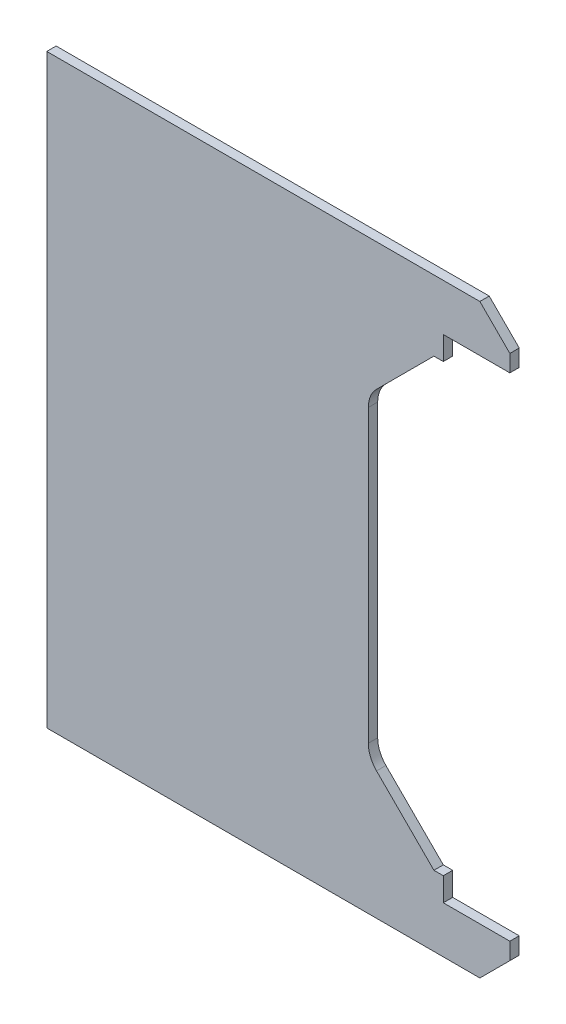
ISO-10303-21;
HEADER;
FILE_DESCRIPTION(('STEP AP214'),'2;1');
FILE_NAME('part.step','',(''),(''),'','','');
FILE_SCHEMA(('AUTOMOTIVE_DESIGN { 1 0 10303 214 1 1 1 1 }'));
ENDSEC;
DATA;
#1=APPLICATION_CONTEXT('core data for automotive mechanical design processes');
#2=APPLICATION_PROTOCOL_DEFINITION('international standard','automotive_design',2000,#1);
#3=PRODUCT_CONTEXT('',#1,'mechanical');
#4=PRODUCT('Part','Part','',(#3));
#5=PRODUCT_RELATED_PRODUCT_CATEGORY('part','',(#4));
#6=PRODUCT_DEFINITION_FORMATION('','',#4);
#7=PRODUCT_DEFINITION_CONTEXT('part definition',#1,'design');
#8=PRODUCT_DEFINITION('design','',#6,#7);
#9=PRODUCT_DEFINITION_SHAPE('','',#8);
#10=(LENGTH_UNIT() NAMED_UNIT(*) SI_UNIT(.MILLI.,.METRE.));
#11=(NAMED_UNIT(*) PLANE_ANGLE_UNIT() SI_UNIT($,.RADIAN.));
#12=(NAMED_UNIT(*) SI_UNIT($,.STERADIAN.) SOLID_ANGLE_UNIT());
#13=UNCERTAINTY_MEASURE_WITH_UNIT(LENGTH_MEASURE(1.E-05),#10,'distance_accuracy_value','');
#14=(GEOMETRIC_REPRESENTATION_CONTEXT(3) GLOBAL_UNCERTAINTY_ASSIGNED_CONTEXT((#13)) GLOBAL_UNIT_ASSIGNED_CONTEXT((#10,
#11,#12)) REPRESENTATION_CONTEXT('',''));
#15=CARTESIAN_POINT('',(0.,0.,0.));
#16=DIRECTION('',(0.,0.,1.));
#17=DIRECTION('',(1.,0.,0.));
#18=AXIS2_PLACEMENT_3D('',#15,#16,#17);
#19=CARTESIAN_POINT('',(423.,50.,10.));
#20=DIRECTION('',(0.,-1.,0.));
#21=DIRECTION('',(0.,0.,-1.));
#22=AXIS2_PLACEMENT_3D('',#19,#20,#21);
#23=PLANE('',#22);
#24=DIRECTION('',(-1.,0.,0.));
#25=VECTOR('',#24,1.);
#26=CARTESIAN_POINT('',(423.,50.,0.));
#27=LINE('',#26,#25);
#28=CARTESIAN_POINT('',(494.,50.,0.));
#29=VERTEX_POINT('',#28);
#30=CARTESIAN_POINT('',(423.,50.,0.));
#31=VERTEX_POINT('',#30);
#32=EDGE_CURVE('E191',#29,#31,#27,.T.);
#33=ORIENTED_EDGE('',*,*,#32,.T.);
#34=DIRECTION('',(0.,0.,-1.));
#35=VECTOR('',#34,1.);
#36=CARTESIAN_POINT('',(423.,50.,10.));
#37=LINE('',#36,#35);
#38=CARTESIAN_POINT('',(423.,50.,10.));
#39=VERTEX_POINT('',#38);
#40=EDGE_CURVE('E169',#39,#31,#37,.T.);
#41=ORIENTED_EDGE('',*,*,#40,.F.);
#42=DIRECTION('',(-1.,0.,0.));
#43=VECTOR('',#42,1.);
#44=CARTESIAN_POINT('',(423.,50.,10.));
#45=LINE('',#44,#43);
#46=CARTESIAN_POINT('',(494.,50.,10.));
#47=VERTEX_POINT('',#46);
#48=EDGE_CURVE('E178',#47,#39,#45,.T.);
#49=ORIENTED_EDGE('',*,*,#48,.F.);
#50=DIRECTION('',(0.,0.,-1.));
#51=VECTOR('',#50,1.);
#52=CARTESIAN_POINT('',(494.,50.,10.));
#53=LINE('',#52,#51);
#54=EDGE_CURVE('E299',#47,#29,#53,.T.);
#55=ORIENTED_EDGE('',*,*,#54,.T.);
#56=EDGE_LOOP('',(#33,#41,#49,#55));
#57=FACE_BOUND('',#56,.T.);
#58=ADVANCED_FACE('F40',(#57),#23,.F.);
#59=CARTESIAN_POINT('',(423.,50.,10.));
#60=DIRECTION('',(-1.,0.,0.));
#61=DIRECTION('',(0.,0.,1.));
#62=AXIS2_PLACEMENT_3D('',#59,#60,#61);
#63=PLANE('',#62);
#64=DIRECTION('',(0.,1.,0.));
#65=VECTOR('',#64,1.);
#66=CARTESIAN_POINT('',(423.,50.,0.));
#67=LINE('',#66,#65);
#68=CARTESIAN_POINT('',(423.,75.,0.));
#69=VERTEX_POINT('',#68);
#70=EDGE_CURVE('E371',#31,#69,#67,.T.);
#71=ORIENTED_EDGE('',*,*,#70,.T.);
#72=DIRECTION('',(0.,0.,-1.));
#73=VECTOR('',#72,1.);
#74=CARTESIAN_POINT('',(423.,75.,10.));
#75=LINE('',#74,#73);
#76=CARTESIAN_POINT('',(423.,75.,10.));
#77=VERTEX_POINT('',#76);
#78=EDGE_CURVE('E172',#77,#69,#75,.T.);
#79=ORIENTED_EDGE('',*,*,#78,.F.);
#80=DIRECTION('',(0.,1.,0.));
#81=VECTOR('',#80,1.);
#82=CARTESIAN_POINT('',(423.,50.,10.));
#83=LINE('',#82,#81);
#84=EDGE_CURVE('E165',#39,#77,#83,.T.);
#85=ORIENTED_EDGE('',*,*,#84,.F.);
#86=ORIENTED_EDGE('',*,*,#40,.T.);
#87=EDGE_LOOP('',(#71,#79,#85,#86));
#88=FACE_BOUND('',#87,.T.);
#89=ADVANCED_FACE('F167',(#88),#63,.F.);
#90=CARTESIAN_POINT('',(423.,75.,10.));
#91=DIRECTION('',(0.,-1.,0.));
#92=DIRECTION('',(1.,0.,0.));
#93=AXIS2_PLACEMENT_3D('',#90,#91,#92);
#94=PLANE('',#93);
#95=DIRECTION('',(-1.,0.,0.));
#96=VECTOR('',#95,1.);
#97=CARTESIAN_POINT('',(423.,75.,0.));
#98=LINE('',#97,#96);
#99=CARTESIAN_POINT('',(413.,75.,0.));
#100=VERTEX_POINT('',#99);
#101=EDGE_CURVE('E253',#69,#100,#98,.T.);
#102=ORIENTED_EDGE('',*,*,#101,.T.);
#103=DIRECTION('',(0.,0.,1.));
#104=VECTOR('',#103,1.);
#105=CARTESIAN_POINT('',(413.,75.,10.));
#106=LINE('',#105,#104);
#107=CARTESIAN_POINT('',(413.,75.,10.));
#108=VERTEX_POINT('',#107);
#109=EDGE_CURVE('E198',#100,#108,#106,.T.);
#110=ORIENTED_EDGE('',*,*,#109,.T.);
#111=DIRECTION('',(-1.,0.,0.));
#112=VECTOR('',#111,1.);
#113=CARTESIAN_POINT('',(423.,75.,10.));
#114=LINE('',#113,#112);
#115=EDGE_CURVE('E177',#77,#108,#114,.T.);
#116=ORIENTED_EDGE('',*,*,#115,.F.);
#117=ORIENTED_EDGE('',*,*,#78,.T.);
#118=EDGE_LOOP('',(#102,#110,#116,#117));
#119=FACE_BOUND('',#118,.T.);
#120=ADVANCED_FACE('F378',(#119),#94,.F.);
#121=CARTESIAN_POINT('',(343.,550.,10.));
#122=DIRECTION('',(-1.,0.,0.));
#123=DIRECTION('',(0.,-1.,0.));
#124=AXIS2_PLACEMENT_3D('',#121,#122,#123);
#125=PLANE('',#124);
#126=DIRECTION('',(0.,1.,0.));
#127=VECTOR('',#126,1.);
#128=CARTESIAN_POINT('',(343.,550.,0.));
#129=LINE('',#128,#127);
#130=CARTESIAN_POINT('',(343.,157.426406871193,0.));
#131=VERTEX_POINT('',#130);
#132=CARTESIAN_POINT('',(343.,467.573593128807,0.));
#133=VERTEX_POINT('',#132);
#134=EDGE_CURVE('E241',#131,#133,#129,.T.);
#135=ORIENTED_EDGE('',*,*,#134,.T.);
#136=DIRECTION('',(0.,0.,-1.));
#137=VECTOR('',#136,1.);
#138=CARTESIAN_POINT('',(343.,467.573593128807,10.));
#139=LINE('',#138,#137);
#140=CARTESIAN_POINT('',(343.,467.573593128807,10.));
#141=VERTEX_POINT('',#140);
#142=EDGE_CURVE('E223',#133,#141,#139,.F.);
#143=ORIENTED_EDGE('',*,*,#142,.T.);
#144=DIRECTION('',(0.,1.,0.));
#145=VECTOR('',#144,1.);
#146=CARTESIAN_POINT('',(343.,550.,10.));
#147=LINE('',#146,#145);
#148=CARTESIAN_POINT('',(343.,157.426406871193,10.));
#149=VERTEX_POINT('',#148);
#150=EDGE_CURVE('E258',#149,#141,#147,.T.);
#151=ORIENTED_EDGE('',*,*,#150,.F.);
#152=DIRECTION('',(0.,0.,1.));
#153=VECTOR('',#152,1.);
#154=CARTESIAN_POINT('',(343.,157.426406871193,0.));
#155=LINE('',#154,#153);
#156=EDGE_CURVE('E219',#149,#131,#155,.F.);
#157=ORIENTED_EDGE('',*,*,#156,.T.);
#158=EDGE_LOOP('',(#135,#143,#151,#157));
#159=FACE_BOUND('',#158,.T.);
#160=ADVANCED_FACE('F247',(#159),#125,.F.);
#161=CARTESIAN_POINT('',(343.,550.,10.));
#162=DIRECTION('',(0.,1.,0.));
#163=DIRECTION('',(0.,0.,1.));
#164=AXIS2_PLACEMENT_3D('',#161,#162,#163);
#165=PLANE('',#164);
#166=DIRECTION('',(1.,0.,0.));
#167=VECTOR('',#166,1.);
#168=CARTESIAN_POINT('',(343.,550.,10.));
#169=LINE('',#168,#167);
#170=CARTESIAN_POINT('',(413.000000000001,550.,10.));
#171=VERTEX_POINT('',#170);
#172=CARTESIAN_POINT('',(423.,550.,10.));
#173=VERTEX_POINT('',#172);
#174=EDGE_CURVE('E266',#171,#173,#169,.T.);
#175=ORIENTED_EDGE('',*,*,#174,.F.);
#176=DIRECTION('',(0.,0.,-1.));
#177=VECTOR('',#176,1.);
#178=CARTESIAN_POINT('',(413.000000000001,550.,0.));
#179=LINE('',#178,#177);
#180=CARTESIAN_POINT('',(413.000000000001,550.,0.));
#181=VERTEX_POINT('',#180);
#182=EDGE_CURVE('E193',#171,#181,#179,.T.);
#183=ORIENTED_EDGE('',*,*,#182,.T.);
#184=DIRECTION('',(1.,0.,0.));
#185=VECTOR('',#184,1.);
#186=CARTESIAN_POINT('',(343.,550.,0.));
#187=LINE('',#186,#185);
#188=CARTESIAN_POINT('',(423.,550.,0.));
#189=VERTEX_POINT('',#188);
#190=EDGE_CURVE('E252',#181,#189,#187,.T.);
#191=ORIENTED_EDGE('',*,*,#190,.T.);
#192=DIRECTION('',(0.,0.,-1.));
#193=VECTOR('',#192,1.);
#194=CARTESIAN_POINT('',(423.,550.,10.));
#195=LINE('',#194,#193);
#196=EDGE_CURVE('E200',#173,#189,#195,.T.);
#197=ORIENTED_EDGE('',*,*,#196,.F.);
#198=EDGE_LOOP('',(#175,#183,#191,#197));
#199=FACE_BOUND('',#198,.T.);
#200=ADVANCED_FACE('F263',(#199),#165,.F.);
#201=CARTESIAN_POINT('',(423.,550.,10.));
#202=DIRECTION('',(-1.,0.,0.));
#203=DIRECTION('',(0.,0.,1.));
#204=AXIS2_PLACEMENT_3D('',#201,#202,#203);
#205=PLANE('',#204);
#206=DIRECTION('',(0.,1.,0.));
#207=VECTOR('',#206,1.);
#208=CARTESIAN_POINT('',(423.,550.,0.));
#209=LINE('',#208,#207);
#210=CARTESIAN_POINT('',(423.,575.,0.));
#211=VERTEX_POINT('',#210);
#212=EDGE_CURVE('E269',#189,#211,#209,.T.);
#213=ORIENTED_EDGE('',*,*,#212,.T.);
#214=DIRECTION('',(0.,0.,-1.));
#215=VECTOR('',#214,1.);
#216=CARTESIAN_POINT('',(423.,575.,10.));
#217=LINE('',#216,#215);
#218=CARTESIAN_POINT('',(423.,575.,10.));
#219=VERTEX_POINT('',#218);
#220=EDGE_CURVE('E330',#219,#211,#217,.T.);
#221=ORIENTED_EDGE('',*,*,#220,.F.);
#222=DIRECTION('',(0.,1.,0.));
#223=VECTOR('',#222,1.);
#224=CARTESIAN_POINT('',(423.,550.,10.));
#225=LINE('',#224,#223);
#226=EDGE_CURVE('E338',#173,#219,#225,.T.);
#227=ORIENTED_EDGE('',*,*,#226,.F.);
#228=ORIENTED_EDGE('',*,*,#196,.T.);
#229=EDGE_LOOP('',(#213,#221,#227,#228));
#230=FACE_BOUND('',#229,.T.);
#231=ADVANCED_FACE('F336',(#230),#205,.F.);
#232=CARTESIAN_POINT('',(423.,575.,10.));
#233=DIRECTION('',(0.,1.,0.));
#234=DIRECTION('',(-1.,0.,0.));
#235=AXIS2_PLACEMENT_3D('',#232,#233,#234);
#236=PLANE('',#235);
#237=DIRECTION('',(1.,0.,0.));
#238=VECTOR('',#237,1.);
#239=CARTESIAN_POINT('',(423.,575.,0.));
#240=LINE('',#239,#238);
#241=CARTESIAN_POINT('',(494.,575.,0.));
#242=VERTEX_POINT('',#241);
#243=EDGE_CURVE('E273',#211,#242,#240,.T.);
#244=ORIENTED_EDGE('',*,*,#243,.T.);
#245=DIRECTION('',(0.,0.,-1.));
#246=VECTOR('',#245,1.);
#247=CARTESIAN_POINT('',(494.,575.,10.));
#248=LINE('',#247,#246);
#249=CARTESIAN_POINT('',(494.,575.,10.));
#250=VERTEX_POINT('',#249);
#251=EDGE_CURVE('E326',#250,#242,#248,.T.);
#252=ORIENTED_EDGE('',*,*,#251,.F.);
#253=DIRECTION('',(1.,0.,0.));
#254=VECTOR('',#253,1.);
#255=CARTESIAN_POINT('',(423.,575.,10.));
#256=LINE('',#255,#254);
#257=EDGE_CURVE('E341',#219,#250,#256,.T.);
#258=ORIENTED_EDGE('',*,*,#257,.F.);
#259=ORIENTED_EDGE('',*,*,#220,.T.);
#260=EDGE_LOOP('',(#244,#252,#258,#259));
#261=FACE_BOUND('',#260,.T.);
#262=ADVANCED_FACE('F501',(#261),#236,.F.);
#263=CARTESIAN_POINT('',(494.,575.,10.));
#264=DIRECTION('',(-1.,0.,0.));
#265=DIRECTION('',(0.,-1.,0.));
#266=AXIS2_PLACEMENT_3D('',#263,#264,#265);
#267=PLANE('',#266);
#268=DIRECTION('',(0.,1.,0.));
#269=VECTOR('',#268,1.);
#270=CARTESIAN_POINT('',(494.,575.,0.));
#271=LINE('',#270,#269);
#272=CARTESIAN_POINT('',(494.,593.,0.));
#273=VERTEX_POINT('',#272);
#274=EDGE_CURVE('E279',#242,#273,#271,.T.);
#275=ORIENTED_EDGE('',*,*,#274,.T.);
#276=DIRECTION('',(0.,0.,-1.));
#277=VECTOR('',#276,1.);
#278=CARTESIAN_POINT('',(494.,593.,10.));
#279=LINE('',#278,#277);
#280=CARTESIAN_POINT('',(494.,593.,10.));
#281=VERTEX_POINT('',#280);
#282=EDGE_CURVE('E322',#281,#273,#279,.T.);
#283=ORIENTED_EDGE('',*,*,#282,.F.);
#284=DIRECTION('',(0.,1.,0.));
#285=VECTOR('',#284,1.);
#286=CARTESIAN_POINT('',(494.,575.,10.));
#287=LINE('',#286,#285);
#288=EDGE_CURVE('E345',#250,#281,#287,.T.);
#289=ORIENTED_EDGE('',*,*,#288,.F.);
#290=ORIENTED_EDGE('',*,*,#251,.T.);
#291=EDGE_LOOP('',(#275,#283,#289,#290));
#292=FACE_BOUND('',#291,.T.);
#293=ADVANCED_FACE('F492',(#292),#267,.F.);
#294=CARTESIAN_POINT('',(494.,593.,10.));
#295=DIRECTION('',(-0.707106781186545,-0.70710678118655,0.));
#296=DIRECTION('',(0.70710678118655,-0.707106781186545,0.));
#297=AXIS2_PLACEMENT_3D('',#294,#295,#296);
#298=PLANE('',#297);
#299=DIRECTION('',(-0.70710678118655,0.707106781186545,0.));
#300=VECTOR('',#299,1.);
#301=CARTESIAN_POINT('',(494.,593.,0.));
#302=LINE('',#301,#300);
#303=CARTESIAN_POINT('',(462.,625.,0.));
#304=VERTEX_POINT('',#303);
#305=EDGE_CURVE('E282',#273,#304,#302,.T.);
#306=ORIENTED_EDGE('',*,*,#305,.T.);
#307=DIRECTION('',(0.,0.,-1.));
#308=VECTOR('',#307,1.);
#309=CARTESIAN_POINT('',(462.,625.,10.));
#310=LINE('',#309,#308);
#311=CARTESIAN_POINT('',(462.,625.,10.));
#312=VERTEX_POINT('',#311);
#313=EDGE_CURVE('E318',#312,#304,#310,.T.);
#314=ORIENTED_EDGE('',*,*,#313,.F.);
#315=DIRECTION('',(-0.70710678118655,0.707106781186545,0.));
#316=VECTOR('',#315,1.);
#317=CARTESIAN_POINT('',(494.,593.,10.));
#318=LINE('',#317,#316);
#319=EDGE_CURVE('E352',#281,#312,#318,.T.);
#320=ORIENTED_EDGE('',*,*,#319,.F.);
#321=ORIENTED_EDGE('',*,*,#282,.T.);
#322=EDGE_LOOP('',(#306,#314,#320,#321));
#323=FACE_BOUND('',#322,.T.);
#324=ADVANCED_FACE('F483',(#323),#298,.F.);
#325=CARTESIAN_POINT('',(462.,625.,10.));
#326=DIRECTION('',(0.,-1.,0.));
#327=DIRECTION('',(0.,0.,-1.));
#328=AXIS2_PLACEMENT_3D('',#325,#326,#327);
#329=PLANE('',#328);
#330=DIRECTION('',(-1.,0.,0.));
#331=VECTOR('',#330,1.);
#332=CARTESIAN_POINT('',(462.,625.,0.));
#333=LINE('',#332,#331);
#334=CARTESIAN_POINT('',(0.,625.,0.));
#335=VERTEX_POINT('',#334);
#336=EDGE_CURVE('E285',#304,#335,#333,.T.);
#337=ORIENTED_EDGE('',*,*,#336,.T.);
#338=DIRECTION('',(0.,0.,-1.));
#339=VECTOR('',#338,1.);
#340=CARTESIAN_POINT('',(0.,625.,10.));
#341=LINE('',#340,#339);
#342=CARTESIAN_POINT('',(0.,625.,10.));
#343=VERTEX_POINT('',#342);
#344=EDGE_CURVE('E314',#343,#335,#341,.T.);
#345=ORIENTED_EDGE('',*,*,#344,.F.);
#346=DIRECTION('',(-1.,0.,0.));
#347=VECTOR('',#346,1.);
#348=CARTESIAN_POINT('',(462.,625.,10.));
#349=LINE('',#348,#347);
#350=EDGE_CURVE('E355',#312,#343,#349,.T.);
#351=ORIENTED_EDGE('',*,*,#350,.F.);
#352=ORIENTED_EDGE('',*,*,#313,.T.);
#353=EDGE_LOOP('',(#337,#345,#351,#352));
#354=FACE_BOUND('',#353,.T.);
#355=ADVANCED_FACE('F474',(#354),#329,.F.);
#356=CARTESIAN_POINT('',(0.,0.,10.));
#357=DIRECTION('',(1.,0.,0.));
#358=DIRECTION('',(0.,0.,-1.));
#359=AXIS2_PLACEMENT_3D('',#356,#357,#358);
#360=PLANE('',#359);
#361=DIRECTION('',(0.,-1.,0.));
#362=VECTOR('',#361,1.);
#363=CARTESIAN_POINT('',(0.,0.,0.));
#364=LINE('',#363,#362);
#365=CARTESIAN_POINT('',(0.,0.,0.));
#366=VERTEX_POINT('',#365);
#367=EDGE_CURVE('E288',#335,#366,#364,.T.);
#368=ORIENTED_EDGE('',*,*,#367,.T.);
#369=DIRECTION('',(0.,0.,-1.));
#370=VECTOR('',#369,1.);
#371=CARTESIAN_POINT('',(0.,0.,10.));
#372=LINE('',#371,#370);
#373=CARTESIAN_POINT('',(0.,0.,10.));
#374=VERTEX_POINT('',#373);
#375=EDGE_CURVE('E310',#374,#366,#372,.T.);
#376=ORIENTED_EDGE('',*,*,#375,.F.);
#377=DIRECTION('',(0.,-1.,0.));
#378=VECTOR('',#377,1.);
#379=CARTESIAN_POINT('',(0.,0.,10.));
#380=LINE('',#379,#378);
#381=EDGE_CURVE('E358',#343,#374,#380,.T.);
#382=ORIENTED_EDGE('',*,*,#381,.F.);
#383=ORIENTED_EDGE('',*,*,#344,.T.);
#384=EDGE_LOOP('',(#368,#376,#382,#383));
#385=FACE_BOUND('',#384,.T.);
#386=ADVANCED_FACE('F465',(#385),#360,.F.);
#387=CARTESIAN_POINT('',(0.,0.,10.));
#388=DIRECTION('',(0.,1.,0.));
#389=DIRECTION('',(0.,0.,1.));
#390=AXIS2_PLACEMENT_3D('',#387,#388,#389);
#391=PLANE('',#390);
#392=DIRECTION('',(1.,0.,0.));
#393=VECTOR('',#392,1.);
#394=CARTESIAN_POINT('',(0.,0.,0.));
#395=LINE('',#394,#393);
#396=CARTESIAN_POINT('',(462.,0.,0.));
#397=VERTEX_POINT('',#396);
#398=EDGE_CURVE('E291',#366,#397,#395,.T.);
#399=ORIENTED_EDGE('',*,*,#398,.T.);
#400=DIRECTION('',(0.,0.,-1.));
#401=VECTOR('',#400,1.);
#402=CARTESIAN_POINT('',(462.,0.,10.));
#403=LINE('',#402,#401);
#404=CARTESIAN_POINT('',(462.,0.,10.));
#405=VERTEX_POINT('',#404);
#406=EDGE_CURVE('E306',#405,#397,#403,.T.);
#407=ORIENTED_EDGE('',*,*,#406,.F.);
#408=DIRECTION('',(1.,0.,0.));
#409=VECTOR('',#408,1.);
#410=CARTESIAN_POINT('',(0.,0.,10.));
#411=LINE('',#410,#409);
#412=EDGE_CURVE('E361',#374,#405,#411,.T.);
#413=ORIENTED_EDGE('',*,*,#412,.F.);
#414=ORIENTED_EDGE('',*,*,#375,.T.);
#415=EDGE_LOOP('',(#399,#407,#413,#414));
#416=FACE_BOUND('',#415,.T.);
#417=ADVANCED_FACE('F456',(#416),#391,.F.);
#418=CARTESIAN_POINT('',(462.,0.,10.));
#419=DIRECTION('',(-0.707106781186548,0.707106781186547,0.));
#420=DIRECTION('',(-0.707106781186547,-0.707106781186548,0.));
#421=AXIS2_PLACEMENT_3D('',#418,#419,#420);
#422=PLANE('',#421);
#423=DIRECTION('',(0.707106781186547,0.707106781186548,0.));
#424=VECTOR('',#423,1.);
#425=CARTESIAN_POINT('',(462.,0.,0.));
#426=LINE('',#425,#424);
#427=CARTESIAN_POINT('',(494.,32.,0.));
#428=VERTEX_POINT('',#427);
#429=EDGE_CURVE('E294',#397,#428,#426,.T.);
#430=ORIENTED_EDGE('',*,*,#429,.T.);
#431=DIRECTION('',(0.,0.,-1.));
#432=VECTOR('',#431,1.);
#433=CARTESIAN_POINT('',(494.,32.,10.));
#434=LINE('',#433,#432);
#435=CARTESIAN_POINT('',(494.,32.,10.));
#436=VERTEX_POINT('',#435);
#437=EDGE_CURVE('E302',#436,#428,#434,.T.);
#438=ORIENTED_EDGE('',*,*,#437,.F.);
#439=DIRECTION('',(0.707106781186547,0.707106781186548,0.));
#440=VECTOR('',#439,1.);
#441=CARTESIAN_POINT('',(462.,0.,10.));
#442=LINE('',#441,#440);
#443=EDGE_CURVE('E364',#405,#436,#442,.T.);
#444=ORIENTED_EDGE('',*,*,#443,.F.);
#445=ORIENTED_EDGE('',*,*,#406,.T.);
#446=EDGE_LOOP('',(#430,#438,#444,#445));
#447=FACE_BOUND('',#446,.T.);
#448=ADVANCED_FACE('F446',(#447),#422,.F.);
#449=CARTESIAN_POINT('',(494.,32.,10.));
#450=DIRECTION('',(-1.,0.,0.));
#451=DIRECTION('',(0.,0.,1.));
#452=AXIS2_PLACEMENT_3D('',#449,#450,#451);
#453=PLANE('',#452);
#454=DIRECTION('',(0.,1.,0.));
#455=VECTOR('',#454,1.);
#456=CARTESIAN_POINT('',(494.,32.,0.));
#457=LINE('',#456,#455);
#458=EDGE_CURVE('E188',#428,#29,#457,.T.);
#459=ORIENTED_EDGE('',*,*,#458,.T.);
#460=ORIENTED_EDGE('',*,*,#54,.F.);
#461=DIRECTION('',(0.,1.,0.));
#462=VECTOR('',#461,1.);
#463=CARTESIAN_POINT('',(494.,32.,10.));
#464=LINE('',#463,#462);
#465=EDGE_CURVE('E183',#436,#47,#464,.T.);
#466=ORIENTED_EDGE('',*,*,#465,.F.);
#467=ORIENTED_EDGE('',*,*,#437,.T.);
#468=EDGE_LOOP('',(#459,#460,#466,#467));
#469=FACE_BOUND('',#468,.T.);
#470=ADVANCED_FACE('F438',(#469),#453,.F.);
#471=CARTESIAN_POINT('',(0.,0.,10.));
#472=DIRECTION('',(0.,0.,1.));
#473=DIRECTION('',(1.,0.,0.));
#474=AXIS2_PLACEMENT_3D('',#471,#472,#473);
#475=PLANE('',#474);
#476=ORIENTED_EDGE('',*,*,#48,.T.);
#477=ORIENTED_EDGE('',*,*,#84,.T.);
#478=ORIENTED_EDGE('',*,*,#115,.T.);
#479=DIRECTION('',(0.707106781186544,-0.707106781186551,0.));
#480=VECTOR('',#479,1.);
#481=CARTESIAN_POINT('',(343.,145.000000000001,10.));
#482=LINE('',#481,#480);
#483=CARTESIAN_POINT('',(351.786796564403,136.213203435597,10.));
#484=VERTEX_POINT('',#483);
#485=EDGE_CURVE('E216',#108,#484,#482,.F.);
#486=ORIENTED_EDGE('',*,*,#485,.T.);
#487=CARTESIAN_POINT('',(373.,157.426406871193,10.));
#488=DIRECTION('',(0.,0.,1.));
#489=DIRECTION('',(1.,0.,0.));
#490=AXIS2_PLACEMENT_3D('',#487,#488,#489);
#491=CIRCLE('',#490,30.);
#492=EDGE_CURVE('E11',#484,#149,#491,.F.);
#493=ORIENTED_EDGE('',*,*,#492,.T.);
#494=ORIENTED_EDGE('',*,*,#150,.T.);
#495=CARTESIAN_POINT('',(373.,467.573593128807,10.));
#496=DIRECTION('',(0.,0.,1.));
#497=DIRECTION('',(1.,0.,0.));
#498=AXIS2_PLACEMENT_3D('',#495,#496,#497);
#499=CIRCLE('',#498,30.);
#500=CARTESIAN_POINT('',(351.786796564404,488.786796564404,10.));
#501=VERTEX_POINT('',#500);
#502=EDGE_CURVE('E232',#141,#501,#499,.F.);
#503=ORIENTED_EDGE('',*,*,#502,.T.);
#504=DIRECTION('',(-0.707106781186552,-0.707106781186543,0.));
#505=VECTOR('',#504,1.);
#506=CARTESIAN_POINT('',(413.000000000001,550.,10.));
#507=LINE('',#506,#505);
#508=EDGE_CURVE('E210',#501,#171,#507,.F.);
#509=ORIENTED_EDGE('',*,*,#508,.T.);
#510=ORIENTED_EDGE('',*,*,#174,.T.);
#511=ORIENTED_EDGE('',*,*,#226,.T.);
#512=ORIENTED_EDGE('',*,*,#257,.T.);
#513=ORIENTED_EDGE('',*,*,#288,.T.);
#514=ORIENTED_EDGE('',*,*,#319,.T.);
#515=ORIENTED_EDGE('',*,*,#350,.T.);
#516=ORIENTED_EDGE('',*,*,#381,.T.);
#517=ORIENTED_EDGE('',*,*,#412,.T.);
#518=ORIENTED_EDGE('',*,*,#443,.T.);
#519=ORIENTED_EDGE('',*,*,#465,.T.);
#520=EDGE_LOOP('',(#476,#477,#478,#486,#493,#494,#503,#509,#510,#511,#512,#513,#514,#515,#516,
#517,#518,#519));
#521=FACE_BOUND('',#520,.T.);
#522=ADVANCED_FACE('F181',(#521),#475,.T.);
#523=CARTESIAN_POINT('',(0.,0.,0.));
#524=DIRECTION('',(0.,0.,1.));
#525=DIRECTION('',(1.,0.,0.));
#526=AXIS2_PLACEMENT_3D('',#523,#524,#525);
#527=PLANE('',#526);
#528=ORIENTED_EDGE('',*,*,#32,.F.);
#529=ORIENTED_EDGE('',*,*,#458,.F.);
#530=ORIENTED_EDGE('',*,*,#429,.F.);
#531=ORIENTED_EDGE('',*,*,#398,.F.);
#532=ORIENTED_EDGE('',*,*,#367,.F.);
#533=ORIENTED_EDGE('',*,*,#336,.F.);
#534=ORIENTED_EDGE('',*,*,#305,.F.);
#535=ORIENTED_EDGE('',*,*,#274,.F.);
#536=ORIENTED_EDGE('',*,*,#243,.F.);
#537=ORIENTED_EDGE('',*,*,#212,.F.);
#538=ORIENTED_EDGE('',*,*,#190,.F.);
#539=DIRECTION('',(0.707106781186552,0.707106781186543,0.));
#540=VECTOR('',#539,1.);
#541=CARTESIAN_POINT('',(-68.5000000000021,68.5000000000029,0.));
#542=LINE('',#541,#540);
#543=CARTESIAN_POINT('',(351.786796564404,488.786796564404,0.));
#544=VERTEX_POINT('',#543);
#545=EDGE_CURVE('E206',#181,#544,#542,.F.);
#546=ORIENTED_EDGE('',*,*,#545,.T.);
#547=CARTESIAN_POINT('',(373.,467.573593128807,0.));
#548=DIRECTION('',(0.,0.,1.));
#549=DIRECTION('',(1.,0.,0.));
#550=AXIS2_PLACEMENT_3D('',#547,#548,#549);
#551=CIRCLE('',#550,30.);
#552=EDGE_CURVE('E235',#544,#133,#551,.T.);
#553=ORIENTED_EDGE('',*,*,#552,.T.);
#554=ORIENTED_EDGE('',*,*,#134,.F.);
#555=CARTESIAN_POINT('',(373.,157.426406871193,0.));
#556=DIRECTION('',(0.,0.,1.));
#557=DIRECTION('',(1.,0.,0.));
#558=AXIS2_PLACEMENT_3D('',#555,#556,#557);
#559=CIRCLE('',#558,30.);
#560=CARTESIAN_POINT('',(351.786796564404,136.213203435597,0.));
#561=VERTEX_POINT('',#560);
#562=EDGE_CURVE('E49',#131,#561,#559,.T.);
#563=ORIENTED_EDGE('',*,*,#562,.T.);
#564=DIRECTION('',(-0.707106781186544,0.707106781186551,0.));
#565=VECTOR('',#564,1.);
#566=CARTESIAN_POINT('',(244.000000000002,244.,0.));
#567=LINE('',#566,#565);
#568=EDGE_CURVE('E213',#561,#100,#567,.F.);
#569=ORIENTED_EDGE('',*,*,#568,.T.);
#570=ORIENTED_EDGE('',*,*,#101,.F.);
#571=ORIENTED_EDGE('',*,*,#70,.F.);
#572=EDGE_LOOP('',(#528,#529,#530,#531,#532,#533,#534,#535,#536,#537,#538,#546,#553,#554,#563,
#569,#570,#571));
#573=FACE_BOUND('',#572,.T.);
#574=ADVANCED_FACE('F240',(#573),#527,.F.);
#575=CARTESIAN_POINT('',(413.000000000001,550.,10.));
#576=DIRECTION('',(0.707106781186543,-0.707106781186552,0.));
#577=DIRECTION('',(0.,0.,1.));
#578=AXIS2_PLACEMENT_3D('',#575,#576,#577);
#579=PLANE('',#578);
#580=ORIENTED_EDGE('',*,*,#508,.F.);
#581=DIRECTION('',(0.,0.,1.));
#582=VECTOR('',#581,1.);
#583=CARTESIAN_POINT('',(351.786796564404,488.786796564404,0.));
#584=LINE('',#583,#582);
#585=EDGE_CURVE('E227',#501,#544,#584,.F.);
#586=ORIENTED_EDGE('',*,*,#585,.T.);
#587=ORIENTED_EDGE('',*,*,#545,.F.);
#588=ORIENTED_EDGE('',*,*,#182,.F.);
#589=EDGE_LOOP('',(#580,#586,#587,#588));
#590=FACE_BOUND('',#589,.T.);
#591=ADVANCED_FACE('F261',(#590),#579,.T.);
#592=CARTESIAN_POINT('',(343.,145.000000000001,10.));
#593=DIRECTION('',(0.707106781186551,0.707106781186544,0.));
#594=DIRECTION('',(0.,0.,1.));
#595=AXIS2_PLACEMENT_3D('',#592,#593,#594);
#596=PLANE('',#595);
#597=ORIENTED_EDGE('',*,*,#568,.F.);
#598=DIRECTION('',(0.,0.,-1.));
#599=VECTOR('',#598,1.);
#600=CARTESIAN_POINT('',(351.786796564403,136.213203435597,10.));
#601=LINE('',#600,#599);
#602=EDGE_CURVE('E62',#561,#484,#601,.F.);
#603=ORIENTED_EDGE('',*,*,#602,.T.);
#604=ORIENTED_EDGE('',*,*,#485,.F.);
#605=ORIENTED_EDGE('',*,*,#109,.F.);
#606=EDGE_LOOP('',(#597,#603,#604,#605));
#607=FACE_BOUND('',#606,.T.);
#608=ADVANCED_FACE('F379',(#607),#596,.T.);
#609=CARTESIAN_POINT('',(373.,467.573593128807,10.));
#610=DIRECTION('',(0.,0.,1.));
#611=DIRECTION('',(1.,0.,0.));
#612=AXIS2_PLACEMENT_3D('',#609,#610,#611);
#613=CYLINDRICAL_SURFACE('',#612,30.);
#614=ORIENTED_EDGE('',*,*,#552,.F.);
#615=ORIENTED_EDGE('',*,*,#585,.F.);
#616=ORIENTED_EDGE('',*,*,#502,.F.);
#617=ORIENTED_EDGE('',*,*,#142,.F.);
#618=EDGE_LOOP('',(#614,#615,#616,#617));
#619=FACE_BOUND('',#618,.T.);
#620=ADVANCED_FACE('F255',(#619),#613,.F.);
#621=CARTESIAN_POINT('',(373.,157.426406871193,10.));
#622=DIRECTION('',(0.,0.,-1.));
#623=DIRECTION('',(-1.,0.,0.));
#624=AXIS2_PLACEMENT_3D('',#621,#622,#623);
#625=CYLINDRICAL_SURFACE('',#624,30.);
#626=ORIENTED_EDGE('',*,*,#492,.F.);
#627=ORIENTED_EDGE('',*,*,#602,.F.);
#628=ORIENTED_EDGE('',*,*,#562,.F.);
#629=ORIENTED_EDGE('',*,*,#156,.F.);
#630=EDGE_LOOP('',(#626,#627,#628,#629));
#631=FACE_BOUND('',#630,.T.);
#632=ADVANCED_FACE('F42',(#631),#625,.F.);
#633=CLOSED_SHELL('',(#58,#89,#120,#160,#200,#231,#262,#293,#324,#355,#386,#417,#448,#470,#522,
#574,#591,#608,#620,#632));
#634=MANIFOLD_SOLID_BREP('B2',#633);
#635=ADVANCED_BREP_SHAPE_REPRESENTATION('',(#18,#634),#14);
#636=SHAPE_DEFINITION_REPRESENTATION(#9,#635);
ENDSEC;
END-ISO-10303-21;
